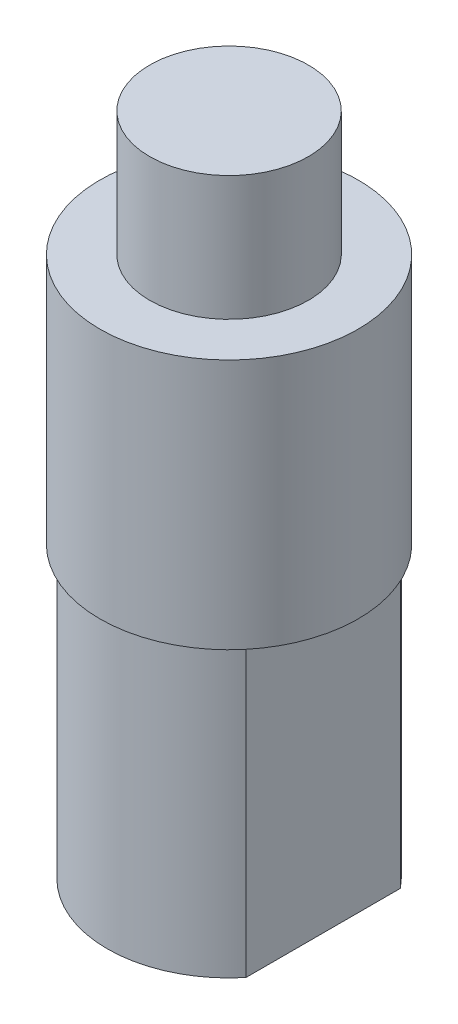
ISO-10303-21;
HEADER;
FILE_DESCRIPTION(('STEP AP214'),'2;1');
FILE_NAME('part.step','',(''),(''),'','','');
FILE_SCHEMA(('AUTOMOTIVE_DESIGN { 1 0 10303 214 1 1 1 1 }'));
ENDSEC;
DATA;
#1=APPLICATION_CONTEXT('core data for automotive mechanical design processes');
#2=APPLICATION_PROTOCOL_DEFINITION('international standard','automotive_design',2000,#1);
#3=PRODUCT_CONTEXT('',#1,'mechanical');
#4=PRODUCT('Part','Part','',(#3));
#5=PRODUCT_RELATED_PRODUCT_CATEGORY('part','',(#4));
#6=PRODUCT_DEFINITION_FORMATION('','',#4);
#7=PRODUCT_DEFINITION_CONTEXT('part definition',#1,'design');
#8=PRODUCT_DEFINITION('design','',#6,#7);
#9=PRODUCT_DEFINITION_SHAPE('','',#8);
#10=(LENGTH_UNIT() NAMED_UNIT(*) SI_UNIT(.MILLI.,.METRE.));
#11=(NAMED_UNIT(*) PLANE_ANGLE_UNIT() SI_UNIT($,.RADIAN.));
#12=(NAMED_UNIT(*) SI_UNIT($,.STERADIAN.) SOLID_ANGLE_UNIT());
#13=UNCERTAINTY_MEASURE_WITH_UNIT(LENGTH_MEASURE(1.E-05),#10,'distance_accuracy_value','');
#14=(GEOMETRIC_REPRESENTATION_CONTEXT(3) GLOBAL_UNCERTAINTY_ASSIGNED_CONTEXT((#13)) GLOBAL_UNIT_ASSIGNED_CONTEXT((#10,
#11,#12)) REPRESENTATION_CONTEXT('',''));
#15=CARTESIAN_POINT('',(0.,0.,0.));
#16=DIRECTION('',(0.,0.,1.));
#17=DIRECTION('',(1.,0.,0.));
#18=AXIS2_PLACEMENT_3D('',#15,#16,#17);
#19=CARTESIAN_POINT('',(0.,-16.125,0.));
#20=DIRECTION('',(0.,1.,0.));
#21=DIRECTION('',(0.,0.,1.));
#22=AXIS2_PLACEMENT_3D('',#19,#20,#21);
#23=PLANE('',#22);
#24=CARTESIAN_POINT('',(0.,-16.125,0.));
#25=DIRECTION('',(0.,1.,0.));
#26=DIRECTION('',(0.,0.,1.));
#27=AXIS2_PLACEMENT_3D('',#24,#25,#26);
#28=CIRCLE('',#27,8.3);
#29=CARTESIAN_POINT('',(0.,-16.125,8.3));
#30=VERTEX_POINT('',#29);
#31=EDGE_CURVE('E52',#30,#30,#28,.T.);
#32=ORIENTED_EDGE('',*,*,#31,.F.);
#33=EDGE_LOOP('',(#32));
#34=FACE_BOUND('',#33,.T.);
#35=CARTESIAN_POINT('',(0.,-16.125,0.));
#36=DIRECTION('',(0.,-1.,0.));
#37=DIRECTION('',(0.,0.,-1.));
#38=AXIS2_PLACEMENT_3D('',#35,#36,#37);
#39=CIRCLE('',#38,7.825);
#40=CARTESIAN_POINT('',(-6.05,-16.125,-4.96267317078205));
#41=VERTEX_POINT('',#40);
#42=CARTESIAN_POINT('',(6.05,-16.125,-4.96267317078205));
#43=VERTEX_POINT('',#42);
#44=EDGE_CURVE('E60',#41,#43,#39,.T.);
#45=ORIENTED_EDGE('',*,*,#44,.F.);
#46=DIRECTION('',(0.,0.,-1.));
#47=VECTOR('',#46,1.);
#48=CARTESIAN_POINT('',(-6.05,-16.125,-4.96267317078205));
#49=LINE('',#48,#47);
#50=CARTESIAN_POINT('',(-6.05,-16.125,4.96267317078205));
#51=VERTEX_POINT('',#50);
#52=EDGE_CURVE('E64',#51,#41,#49,.T.);
#53=ORIENTED_EDGE('',*,*,#52,.F.);
#54=CARTESIAN_POINT('',(0.,-16.125,0.));
#55=DIRECTION('',(0.,-1.,0.));
#56=DIRECTION('',(0.,0.,-1.));
#57=AXIS2_PLACEMENT_3D('',#54,#55,#56);
#58=CIRCLE('',#57,7.825);
#59=CARTESIAN_POINT('',(6.05,-16.125,4.96267317078205));
#60=VERTEX_POINT('',#59);
#61=EDGE_CURVE('E212',#60,#51,#58,.T.);
#62=ORIENTED_EDGE('',*,*,#61,.F.);
#63=DIRECTION('',(0.,0.,1.));
#64=VECTOR('',#63,1.);
#65=CARTESIAN_POINT('',(6.05,-16.125,-4.96267317078205));
#66=LINE('',#65,#64);
#67=EDGE_CURVE('E218',#43,#60,#66,.T.);
#68=ORIENTED_EDGE('',*,*,#67,.F.);
#69=EDGE_LOOP('',(#45,#53,#62,#68));
#70=FACE_BOUND('',#69,.T.);
#71=ADVANCED_FACE('F43',(#34,#70),#23,.F.);
#72=CARTESIAN_POINT('',(0.,-16.125,0.));
#73=DIRECTION('',(0.,1.,0.));
#74=DIRECTION('',(0.,0.,1.));
#75=AXIS2_PLACEMENT_3D('',#72,#73,#74);
#76=CYLINDRICAL_SURFACE('',#75,8.3);
#77=ORIENTED_EDGE('',*,*,#31,.T.);
#78=EDGE_LOOP('',(#77));
#79=FACE_BOUND('',#78,.T.);
#80=CARTESIAN_POINT('',(0.,0.,0.));
#81=DIRECTION('',(0.,1.,0.));
#82=DIRECTION('',(0.,0.,1.));
#83=AXIS2_PLACEMENT_3D('',#80,#81,#82);
#84=CIRCLE('',#83,8.3);
#85=CARTESIAN_POINT('',(0.,0.,8.3));
#86=VERTEX_POINT('',#85);
#87=EDGE_CURVE('E47',#86,#86,#84,.T.);
#88=ORIENTED_EDGE('',*,*,#87,.F.);
#89=EDGE_LOOP('',(#88));
#90=FACE_BOUND('',#89,.T.);
#91=ADVANCED_FACE('F45',(#79,#90),#76,.T.);
#92=CARTESIAN_POINT('',(0.,0.,0.));
#93=DIRECTION('',(0.,1.,0.));
#94=DIRECTION('',(0.,0.,1.));
#95=AXIS2_PLACEMENT_3D('',#92,#93,#94);
#96=PLANE('',#95);
#97=CARTESIAN_POINT('',(0.,0.,0.));
#98=DIRECTION('',(0.,1.,0.));
#99=DIRECTION('',(0.,0.,1.));
#100=AXIS2_PLACEMENT_3D('',#97,#98,#99);
#101=CIRCLE('',#100,5.1);
#102=CARTESIAN_POINT('',(0.,0.,5.1));
#103=VERTEX_POINT('',#102);
#104=EDGE_CURVE('E11',#103,#103,#101,.T.);
#105=ORIENTED_EDGE('',*,*,#104,.F.);
#106=EDGE_LOOP('',(#105));
#107=FACE_BOUND('',#106,.T.);
#108=ORIENTED_EDGE('',*,*,#87,.T.);
#109=EDGE_LOOP('',(#108));
#110=FACE_BOUND('',#109,.T.);
#111=ADVANCED_FACE('F119',(#107,#110),#96,.T.);
#112=CARTESIAN_POINT('',(0.,8.,0.));
#113=DIRECTION('',(0.,-1.,0.));
#114=DIRECTION('',(0.,0.,-1.));
#115=AXIS2_PLACEMENT_3D('',#112,#113,#114);
#116=CYLINDRICAL_SURFACE('',#115,5.1);
#117=CARTESIAN_POINT('',(0.,8.,0.));
#118=DIRECTION('',(0.,1.,0.));
#119=DIRECTION('',(0.,0.,1.));
#120=AXIS2_PLACEMENT_3D('',#117,#118,#119);
#121=CIRCLE('',#120,5.1);
#122=CARTESIAN_POINT('',(0.,8.,5.1));
#123=VERTEX_POINT('',#122);
#124=EDGE_CURVE('E106',#123,#123,#121,.T.);
#125=ORIENTED_EDGE('',*,*,#124,.F.);
#126=EDGE_LOOP('',(#125));
#127=FACE_BOUND('',#126,.T.);
#128=ORIENTED_EDGE('',*,*,#104,.T.);
#129=EDGE_LOOP('',(#128));
#130=FACE_BOUND('',#129,.T.);
#131=ADVANCED_FACE('F125',(#127,#130),#116,.T.);
#132=CARTESIAN_POINT('',(0.,8.,0.));
#133=DIRECTION('',(0.,1.,0.));
#134=DIRECTION('',(0.,0.,1.));
#135=AXIS2_PLACEMENT_3D('',#132,#133,#134);
#136=PLANE('',#135);
#137=ORIENTED_EDGE('',*,*,#124,.T.);
#138=EDGE_LOOP('',(#137));
#139=FACE_BOUND('',#138,.T.);
#140=ADVANCED_FACE('F137',(#139),#136,.T.);
#141=CARTESIAN_POINT('',(0.,-34.725,0.));
#142=DIRECTION('',(0.,1.,0.));
#143=DIRECTION('',(0.,0.,1.));
#144=AXIS2_PLACEMENT_3D('',#141,#142,#143);
#145=CYLINDRICAL_SURFACE('',#144,7.825);
#146=ORIENTED_EDGE('',*,*,#44,.T.);
#147=DIRECTION('',(0.,1.,0.));
#148=VECTOR('',#147,1.);
#149=CARTESIAN_POINT('',(6.05,-34.725,-4.96267317078205));
#150=LINE('',#149,#148);
#151=CARTESIAN_POINT('',(6.05,-34.725,-4.96267317078205));
#152=VERTEX_POINT('',#151);
#153=EDGE_CURVE('E89',#152,#43,#150,.T.);
#154=ORIENTED_EDGE('',*,*,#153,.F.);
#155=CARTESIAN_POINT('',(0.,-34.725,0.));
#156=DIRECTION('',(0.,-1.,0.));
#157=DIRECTION('',(0.,0.,-1.));
#158=AXIS2_PLACEMENT_3D('',#155,#156,#157);
#159=CIRCLE('',#158,7.825);
#160=CARTESIAN_POINT('',(-6.05,-34.725,-4.96267317078205));
#161=VERTEX_POINT('',#160);
#162=EDGE_CURVE('E95',#161,#152,#159,.T.);
#163=ORIENTED_EDGE('',*,*,#162,.F.);
#164=DIRECTION('',(0.,1.,0.));
#165=VECTOR('',#164,1.);
#166=CARTESIAN_POINT('',(-6.05,-34.725,-4.96267317078205));
#167=LINE('',#166,#165);
#168=EDGE_CURVE('E210',#161,#41,#167,.T.);
#169=ORIENTED_EDGE('',*,*,#168,.T.);
#170=EDGE_LOOP('',(#146,#154,#163,#169));
#171=FACE_BOUND('',#170,.T.);
#172=ADVANCED_FACE('F105',(#171),#145,.T.);
#173=CARTESIAN_POINT('',(6.05,-34.725,-4.96267317078205));
#174=DIRECTION('',(-1.,0.,0.));
#175=DIRECTION('',(0.,0.,1.));
#176=AXIS2_PLACEMENT_3D('',#173,#174,#175);
#177=PLANE('',#176);
#178=ORIENTED_EDGE('',*,*,#67,.T.);
#179=DIRECTION('',(0.,1.,0.));
#180=VECTOR('',#179,1.);
#181=CARTESIAN_POINT('',(6.05,-34.725,4.96267317078205));
#182=LINE('',#181,#180);
#183=CARTESIAN_POINT('',(6.05,-34.725,4.96267317078205));
#184=VERTEX_POINT('',#183);
#185=EDGE_CURVE('E91',#184,#60,#182,.T.);
#186=ORIENTED_EDGE('',*,*,#185,.F.);
#187=DIRECTION('',(0.,0.,1.));
#188=VECTOR('',#187,1.);
#189=CARTESIAN_POINT('',(6.05,-34.725,-4.96267317078205));
#190=LINE('',#189,#188);
#191=EDGE_CURVE('E84',#152,#184,#190,.T.);
#192=ORIENTED_EDGE('',*,*,#191,.F.);
#193=ORIENTED_EDGE('',*,*,#153,.T.);
#194=EDGE_LOOP('',(#178,#186,#192,#193));
#195=FACE_BOUND('',#194,.T.);
#196=ADVANCED_FACE('F87',(#195),#177,.F.);
#197=CARTESIAN_POINT('',(0.,-34.725,0.));
#198=DIRECTION('',(0.,1.,0.));
#199=DIRECTION('',(0.,0.,1.));
#200=AXIS2_PLACEMENT_3D('',#197,#198,#199);
#201=CYLINDRICAL_SURFACE('',#200,7.825);
#202=ORIENTED_EDGE('',*,*,#61,.T.);
#203=DIRECTION('',(0.,1.,0.));
#204=VECTOR('',#203,1.);
#205=CARTESIAN_POINT('',(-6.05,-34.725,4.96267317078205));
#206=LINE('',#205,#204);
#207=CARTESIAN_POINT('',(-6.05,-34.725,4.96267317078205));
#208=VERTEX_POINT('',#207);
#209=EDGE_CURVE('E110',#208,#51,#206,.T.);
#210=ORIENTED_EDGE('',*,*,#209,.F.);
#211=CARTESIAN_POINT('',(0.,-34.725,0.));
#212=DIRECTION('',(0.,-1.,0.));
#213=DIRECTION('',(0.,0.,-1.));
#214=AXIS2_PLACEMENT_3D('',#211,#212,#213);
#215=CIRCLE('',#214,7.825);
#216=EDGE_CURVE('E94',#184,#208,#215,.T.);
#217=ORIENTED_EDGE('',*,*,#216,.F.);
#218=ORIENTED_EDGE('',*,*,#185,.T.);
#219=EDGE_LOOP('',(#202,#210,#217,#218));
#220=FACE_BOUND('',#219,.T.);
#221=ADVANCED_FACE('F144',(#220),#201,.T.);
#222=CARTESIAN_POINT('',(-6.05,-34.725,-4.96267317078205));
#223=DIRECTION('',(1.,0.,0.));
#224=DIRECTION('',(0.,0.,-1.));
#225=AXIS2_PLACEMENT_3D('',#222,#223,#224);
#226=PLANE('',#225);
#227=ORIENTED_EDGE('',*,*,#52,.T.);
#228=ORIENTED_EDGE('',*,*,#168,.F.);
#229=DIRECTION('',(0.,0.,-1.));
#230=VECTOR('',#229,1.);
#231=CARTESIAN_POINT('',(-6.05,-34.725,-4.96267317078205));
#232=LINE('',#231,#230);
#233=EDGE_CURVE('E100',#208,#161,#232,.T.);
#234=ORIENTED_EDGE('',*,*,#233,.F.);
#235=ORIENTED_EDGE('',*,*,#209,.T.);
#236=EDGE_LOOP('',(#227,#228,#234,#235));
#237=FACE_BOUND('',#236,.T.);
#238=ADVANCED_FACE('F147',(#237),#226,.F.);
#239=CARTESIAN_POINT('',(0.,-34.725,0.));
#240=DIRECTION('',(0.,-1.,0.));
#241=DIRECTION('',(0.,0.,-1.));
#242=AXIS2_PLACEMENT_3D('',#239,#240,#241);
#243=PLANE('',#242);
#244=ORIENTED_EDGE('',*,*,#162,.T.);
#245=ORIENTED_EDGE('',*,*,#191,.T.);
#246=ORIENTED_EDGE('',*,*,#216,.T.);
#247=ORIENTED_EDGE('',*,*,#233,.T.);
#248=EDGE_LOOP('',(#244,#245,#246,#247));
#249=FACE_BOUND('',#248,.T.);
#250=ADVANCED_FACE('F98',(#249),#243,.T.);
#251=CLOSED_SHELL('',(#71,#91,#111,#131,#140,#172,#196,#221,#238,#250));
#252=MANIFOLD_SOLID_BREP('B2',#251);
#253=ADVANCED_BREP_SHAPE_REPRESENTATION('',(#18,#252),#14);
#254=SHAPE_DEFINITION_REPRESENTATION(#9,#253);
ENDSEC;
END-ISO-10303-21;
